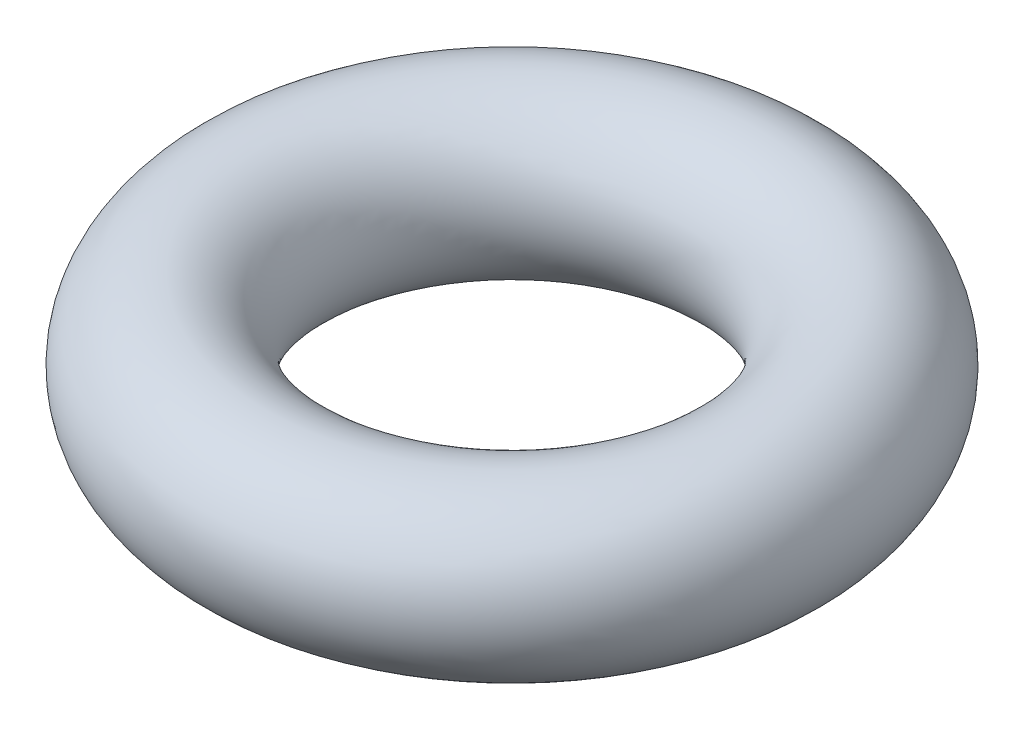
ISO-10303-21;
HEADER;
FILE_DESCRIPTION(('STEP AP214'),'2;1');
FILE_NAME('part.step','',(''),(''),'','','');
FILE_SCHEMA(('AUTOMOTIVE_DESIGN { 1 0 10303 214 1 1 1 1 }'));
ENDSEC;
DATA;
#1=APPLICATION_CONTEXT('core data for automotive mechanical design processes');
#2=APPLICATION_PROTOCOL_DEFINITION('international standard','automotive_design',2000,#1);
#3=PRODUCT_CONTEXT('',#1,'mechanical');
#4=PRODUCT('Part','Part','',(#3));
#5=PRODUCT_RELATED_PRODUCT_CATEGORY('part','',(#4));
#6=PRODUCT_DEFINITION_FORMATION('','',#4);
#7=PRODUCT_DEFINITION_CONTEXT('part definition',#1,'design');
#8=PRODUCT_DEFINITION('design','',#6,#7);
#9=PRODUCT_DEFINITION_SHAPE('','',#8);
#10=(LENGTH_UNIT() NAMED_UNIT(*) SI_UNIT(.MILLI.,.METRE.));
#11=(NAMED_UNIT(*) PLANE_ANGLE_UNIT() SI_UNIT($,.RADIAN.));
#12=(NAMED_UNIT(*) SI_UNIT($,.STERADIAN.) SOLID_ANGLE_UNIT());
#13=UNCERTAINTY_MEASURE_WITH_UNIT(LENGTH_MEASURE(1.E-05),#10,'distance_accuracy_value','');
#14=(GEOMETRIC_REPRESENTATION_CONTEXT(3) GLOBAL_UNCERTAINTY_ASSIGNED_CONTEXT((#13)) GLOBAL_UNIT_ASSIGNED_CONTEXT((#10,
#11,#12)) REPRESENTATION_CONTEXT('',''));
#15=CARTESIAN_POINT('',(0.,0.,0.));
#16=DIRECTION('',(0.,0.,1.));
#17=DIRECTION('',(1.,0.,0.));
#18=AXIS2_PLACEMENT_3D('',#15,#16,#17);
#19=CARTESIAN_POINT('',(0.,0.,0.));
#20=DIRECTION('',(0.,1.,0.));
#21=DIRECTION('',(-1.,0.,0.));
#22=AXIS2_PLACEMENT_3D('',#19,#20,#21);
#23=TOROIDAL_SURFACE('',#22,1.5,0.500000000000001);
#24=CARTESIAN_POINT('',(-2.,0.,0.));
#25=VERTEX_POINT('',#24);
#26=VERTEX_LOOP('',#25);
#27=FACE_BOUND('',#26,.T.);
#28=ADVANCED_FACE('F13',(#27),#23,.T.);
#29=CLOSED_SHELL('',(#28));
#30=MANIFOLD_SOLID_BREP('B1',#29);
#31=ADVANCED_BREP_SHAPE_REPRESENTATION('',(#18,#30),#14);
#32=SHAPE_DEFINITION_REPRESENTATION(#9,#31);
ENDSEC;
END-ISO-10303-21;
